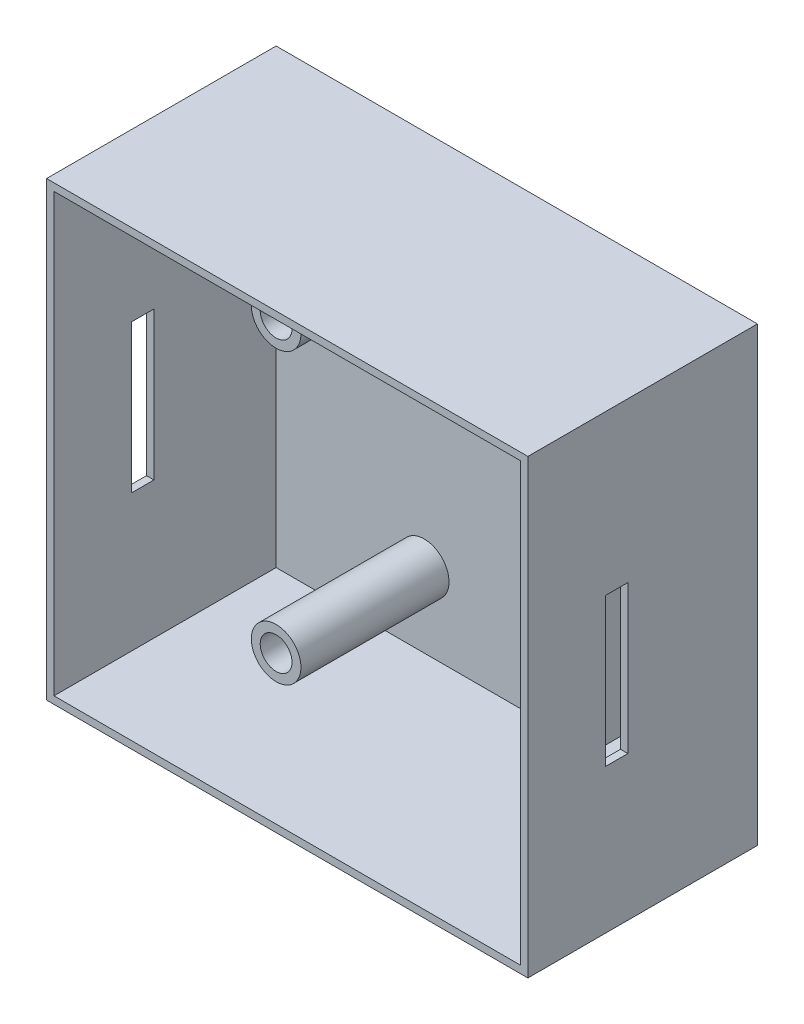
ISO-10303-21;
HEADER;
FILE_DESCRIPTION(('STEP AP214'),'2;1');
FILE_NAME('part.step','',(''),(''),'','','');
FILE_SCHEMA(('AUTOMOTIVE_DESIGN { 1 0 10303 214 1 1 1 1 }'));
ENDSEC;
DATA;
#1=APPLICATION_CONTEXT('core data for automotive mechanical design processes');
#2=APPLICATION_PROTOCOL_DEFINITION('international standard','automotive_design',2000,#1);
#3=PRODUCT_CONTEXT('',#1,'mechanical');
#4=PRODUCT('Part','Part','',(#3));
#5=PRODUCT_RELATED_PRODUCT_CATEGORY('part','',(#4));
#6=PRODUCT_DEFINITION_FORMATION('','',#4);
#7=PRODUCT_DEFINITION_CONTEXT('part definition',#1,'design');
#8=PRODUCT_DEFINITION('design','',#6,#7);
#9=PRODUCT_DEFINITION_SHAPE('','',#8);
#10=(LENGTH_UNIT() NAMED_UNIT(*) SI_UNIT(.MILLI.,.METRE.));
#11=(NAMED_UNIT(*) PLANE_ANGLE_UNIT() SI_UNIT($,.RADIAN.));
#12=(NAMED_UNIT(*) SI_UNIT($,.STERADIAN.) SOLID_ANGLE_UNIT());
#13=UNCERTAINTY_MEASURE_WITH_UNIT(LENGTH_MEASURE(1.E-05),#10,'distance_accuracy_value','');
#14=(GEOMETRIC_REPRESENTATION_CONTEXT(3) GLOBAL_UNCERTAINTY_ASSIGNED_CONTEXT((#13)) GLOBAL_UNIT_ASSIGNED_CONTEXT((#10,
#11,#12)) REPRESENTATION_CONTEXT('',''));
#15=CARTESIAN_POINT('',(0.,0.,0.));
#16=DIRECTION('',(0.,0.,1.));
#17=DIRECTION('',(1.,0.,0.));
#18=AXIS2_PLACEMENT_3D('',#15,#16,#17);
#19=CARTESIAN_POINT('',(0.,0.,0.));
#20=DIRECTION('',(0.,0.,-1.));
#21=DIRECTION('',(-1.,0.,0.));
#22=AXIS2_PLACEMENT_3D('',#19,#20,#21);
#23=PLANE('',#22);
#24=DIRECTION('',(0.,1.,0.));
#25=VECTOR('',#24,1.);
#26=CARTESIAN_POINT('',(-31.5,0.,0.));
#27=LINE('',#26,#25);
#28=CARTESIAN_POINT('',(-31.5,-29.5,0.));
#29=VERTEX_POINT('',#28);
#30=CARTESIAN_POINT('',(-31.5,29.5,0.));
#31=VERTEX_POINT('',#30);
#32=EDGE_CURVE('E359',#29,#31,#27,.T.);
#33=ORIENTED_EDGE('',*,*,#32,.F.);
#34=DIRECTION('',(1.,0.,0.));
#35=VECTOR('',#34,1.);
#36=CARTESIAN_POINT('',(0.,-29.5,0.));
#37=LINE('',#36,#35);
#38=CARTESIAN_POINT('',(31.5,-29.5,0.));
#39=VERTEX_POINT('',#38);
#40=EDGE_CURVE('E356',#29,#39,#37,.T.);
#41=ORIENTED_EDGE('',*,*,#40,.T.);
#42=DIRECTION('',(0.,1.,0.));
#43=VECTOR('',#42,1.);
#44=CARTESIAN_POINT('',(31.5,0.,0.));
#45=LINE('',#44,#43);
#46=CARTESIAN_POINT('',(31.5,-23.5,0.));
#47=VERTEX_POINT('',#46);
#48=EDGE_CURVE('E354',#39,#47,#45,.T.);
#49=ORIENTED_EDGE('',*,*,#48,.T.);
#50=DIRECTION('',(1.,0.,0.));
#51=VECTOR('',#50,1.);
#52=CARTESIAN_POINT('',(0.,-23.5,0.));
#53=LINE('',#52,#51);
#54=CARTESIAN_POINT('',(17.5,-23.5,0.));
#55=VERTEX_POINT('',#54);
#56=EDGE_CURVE('E301',#55,#47,#53,.T.);
#57=ORIENTED_EDGE('',*,*,#56,.F.);
#58=DIRECTION('',(0.,-1.,0.));
#59=VECTOR('',#58,1.);
#60=CARTESIAN_POINT('',(17.5,0.,0.));
#61=LINE('',#60,#59);
#62=CARTESIAN_POINT('',(17.5,24.5,0.));
#63=VERTEX_POINT('',#62);
#64=EDGE_CURVE('E298',#63,#55,#61,.T.);
#65=ORIENTED_EDGE('',*,*,#64,.F.);
#66=DIRECTION('',(-1.,0.,0.));
#67=VECTOR('',#66,1.);
#68=CARTESIAN_POINT('',(0.,24.5,0.));
#69=LINE('',#68,#67);
#70=CARTESIAN_POINT('',(31.5,24.5,0.));
#71=VERTEX_POINT('',#70);
#72=EDGE_CURVE('E295',#71,#63,#69,.T.);
#73=ORIENTED_EDGE('',*,*,#72,.F.);
#74=CARTESIAN_POINT('',(31.5,29.5,0.));
#75=VERTEX_POINT('',#74);
#76=EDGE_CURVE('E329',#71,#75,#45,.T.);
#77=ORIENTED_EDGE('',*,*,#76,.T.);
#78=DIRECTION('',(1.,0.,0.));
#79=VECTOR('',#78,1.);
#80=CARTESIAN_POINT('',(0.,29.5,0.));
#81=LINE('',#80,#79);
#82=EDGE_CURVE('E334',#31,#75,#81,.T.);
#83=ORIENTED_EDGE('',*,*,#82,.F.);
#84=EDGE_LOOP('',(#33,#41,#49,#57,#65,#73,#77,#83));
#85=FACE_BOUND('',#84,.T.);
#86=CARTESIAN_POINT('',(-11.5,19.5,0.));
#87=DIRECTION('',(0.,0.,1.));
#88=DIRECTION('',(1.,0.,0.));
#89=AXIS2_PLACEMENT_3D('',#86,#87,#88);
#90=CIRCLE('',#89,3.35);
#91=CARTESIAN_POINT('',(-8.14999999999998,19.5,0.));
#92=VERTEX_POINT('',#91);
#93=EDGE_CURVE('E398',#92,#92,#90,.F.);
#94=ORIENTED_EDGE('',*,*,#93,.T.);
#95=EDGE_LOOP('',(#94));
#96=FACE_BOUND('',#95,.T.);
#97=CARTESIAN_POINT('',(-11.5,-19.5,0.));
#98=DIRECTION('',(0.,0.,-1.));
#99=DIRECTION('',(-1.,0.,0.));
#100=AXIS2_PLACEMENT_3D('',#97,#98,#99);
#101=CIRCLE('',#100,3.35);
#102=CARTESIAN_POINT('',(-14.85,-19.5,0.));
#103=VERTEX_POINT('',#102);
#104=EDGE_CURVE('E11',#103,#103,#101,.F.);
#105=ORIENTED_EDGE('',*,*,#104,.F.);
#106=EDGE_LOOP('',(#105));
#107=FACE_BOUND('',#106,.T.);
#108=ADVANCED_FACE('F41',(#85,#96,#107),#23,.F.);
#109=CARTESIAN_POINT('',(-11.5,19.5,20.));
#110=DIRECTION('',(0.,0.,-1.));
#111=DIRECTION('',(-1.,0.,0.));
#112=AXIS2_PLACEMENT_3D('',#109,#110,#111);
#113=CYLINDRICAL_SURFACE('',#112,3.35);
#114=CARTESIAN_POINT('',(-11.5,19.5,20.));
#115=DIRECTION('',(0.,0.,1.));
#116=DIRECTION('',(1.,0.,0.));
#117=AXIS2_PLACEMENT_3D('',#114,#115,#116);
#118=CIRCLE('',#117,3.35);
#119=CARTESIAN_POINT('',(-8.14999999999998,19.5,20.));
#120=VERTEX_POINT('',#119);
#121=EDGE_CURVE('E399',#120,#120,#118,.F.);
#122=ORIENTED_EDGE('',*,*,#121,.T.);
#123=EDGE_LOOP('',(#122));
#124=FACE_BOUND('',#123,.T.);
#125=ORIENTED_EDGE('',*,*,#93,.F.);
#126=EDGE_LOOP('',(#125));
#127=FACE_BOUND('',#126,.T.);
#128=ADVANCED_FACE('F43',(#124,#127),#113,.T.);
#129=CARTESIAN_POINT('',(-11.5,19.5,20.));
#130=DIRECTION('',(0.,0.,-1.));
#131=DIRECTION('',(-1.,0.,0.));
#132=AXIS2_PLACEMENT_3D('',#129,#130,#131);
#133=CYLINDRICAL_SURFACE('',#132,2.15);
#134=CARTESIAN_POINT('',(-11.5,19.5,20.));
#135=DIRECTION('',(0.,0.,1.));
#136=DIRECTION('',(1.,0.,0.));
#137=AXIS2_PLACEMENT_3D('',#134,#135,#136);
#138=CIRCLE('',#137,2.15);
#139=CARTESIAN_POINT('',(-9.34999999999998,19.5,20.));
#140=VERTEX_POINT('',#139);
#141=EDGE_CURVE('E50',#140,#140,#138,.F.);
#142=ORIENTED_EDGE('',*,*,#141,.F.);
#143=EDGE_LOOP('',(#142));
#144=FACE_BOUND('',#143,.T.);
#145=CARTESIAN_POINT('',(-11.5,19.5,-1.));
#146=DIRECTION('',(0.,0.,-1.));
#147=DIRECTION('',(-1.,0.,0.));
#148=AXIS2_PLACEMENT_3D('',#145,#146,#147);
#149=CIRCLE('',#148,2.15);
#150=CARTESIAN_POINT('',(-13.65,19.5,-1.));
#151=VERTEX_POINT('',#150);
#152=EDGE_CURVE('E405',#151,#151,#149,.T.);
#153=ORIENTED_EDGE('',*,*,#152,.T.);
#154=EDGE_LOOP('',(#153));
#155=FACE_BOUND('',#154,.T.);
#156=ADVANCED_FACE('F497',(#144,#155),#133,.F.);
#157=CARTESIAN_POINT('',(0.,0.,20.));
#158=DIRECTION('',(0.,0.,1.));
#159=DIRECTION('',(1.,0.,0.));
#160=AXIS2_PLACEMENT_3D('',#157,#158,#159);
#161=PLANE('',#160);
#162=ORIENTED_EDGE('',*,*,#121,.F.);
#163=EDGE_LOOP('',(#162));
#164=FACE_BOUND('',#163,.T.);
#165=ORIENTED_EDGE('',*,*,#141,.T.);
#166=EDGE_LOOP('',(#165));
#167=FACE_BOUND('',#166,.T.);
#168=ADVANCED_FACE('F502',(#164,#167),#161,.T.);
#169=CARTESIAN_POINT('',(-11.5,-19.5,20.));
#170=DIRECTION('',(0.,0.,-1.));
#171=DIRECTION('',(-1.,0.,0.));
#172=AXIS2_PLACEMENT_3D('',#169,#170,#171);
#173=CYLINDRICAL_SURFACE('',#172,2.15);
#174=CARTESIAN_POINT('',(-11.5,-19.5,20.));
#175=DIRECTION('',(0.,0.,1.));
#176=DIRECTION('',(1.,0.,0.));
#177=AXIS2_PLACEMENT_3D('',#174,#175,#176);
#178=CIRCLE('',#177,2.15);
#179=CARTESIAN_POINT('',(-9.34999999999998,-19.5,20.));
#180=VERTEX_POINT('',#179);
#181=EDGE_CURVE('E375',#180,#180,#178,.T.);
#182=ORIENTED_EDGE('',*,*,#181,.T.);
#183=EDGE_LOOP('',(#182));
#184=FACE_BOUND('',#183,.T.);
#185=CARTESIAN_POINT('',(-11.5,-19.5,-1.));
#186=DIRECTION('',(0.,0.,-1.));
#187=DIRECTION('',(-1.,0.,0.));
#188=AXIS2_PLACEMENT_3D('',#185,#186,#187);
#189=CIRCLE('',#188,2.15);
#190=CARTESIAN_POINT('',(-13.65,-19.5,-1.));
#191=VERTEX_POINT('',#190);
#192=EDGE_CURVE('E45',#191,#191,#189,.T.);
#193=ORIENTED_EDGE('',*,*,#192,.T.);
#194=EDGE_LOOP('',(#193));
#195=FACE_BOUND('',#194,.T.);
#196=ADVANCED_FACE('F511',(#184,#195),#173,.F.);
#197=CARTESIAN_POINT('',(-11.5,-19.5,20.));
#198=DIRECTION('',(0.,0.,-1.));
#199=DIRECTION('',(-1.,0.,0.));
#200=AXIS2_PLACEMENT_3D('',#197,#198,#199);
#201=CYLINDRICAL_SURFACE('',#200,3.35);
#202=CARTESIAN_POINT('',(-11.5,-19.5,20.));
#203=DIRECTION('',(0.,0.,1.));
#204=DIRECTION('',(1.,0.,0.));
#205=AXIS2_PLACEMENT_3D('',#202,#203,#204);
#206=CIRCLE('',#205,3.35);
#207=CARTESIAN_POINT('',(-8.14999999999998,-19.5,20.));
#208=VERTEX_POINT('',#207);
#209=EDGE_CURVE('E378',#208,#208,#206,.T.);
#210=ORIENTED_EDGE('',*,*,#209,.F.);
#211=EDGE_LOOP('',(#210));
#212=FACE_BOUND('',#211,.T.);
#213=ORIENTED_EDGE('',*,*,#104,.T.);
#214=EDGE_LOOP('',(#213));
#215=FACE_BOUND('',#214,.T.);
#216=ADVANCED_FACE('F510',(#212,#215),#201,.T.);
#217=CARTESIAN_POINT('',(0.,0.,20.));
#218=DIRECTION('',(0.,0.,1.));
#219=DIRECTION('',(1.,0.,0.));
#220=AXIS2_PLACEMENT_3D('',#217,#218,#219);
#221=PLANE('',#220);
#222=ORIENTED_EDGE('',*,*,#181,.F.);
#223=EDGE_LOOP('',(#222));
#224=FACE_BOUND('',#223,.T.);
#225=ORIENTED_EDGE('',*,*,#209,.T.);
#226=EDGE_LOOP('',(#225));
#227=FACE_BOUND('',#226,.T.);
#228=ADVANCED_FACE('F424',(#224,#227),#221,.T.);
#229=CARTESIAN_POINT('',(31.5,0.,30.));
#230=DIRECTION('',(-1.,0.,0.));
#231=DIRECTION('',(0.,0.,1.));
#232=AXIS2_PLACEMENT_3D('',#229,#230,#231);
#233=PLANE('',#232);
#234=DIRECTION('',(0.,1.,0.));
#235=VECTOR('',#234,1.);
#236=CARTESIAN_POINT('',(31.5,0.,19.5));
#237=LINE('',#236,#235);
#238=CARTESIAN_POINT('',(31.5,-11.,19.5));
#239=VERTEX_POINT('',#238);
#240=CARTESIAN_POINT('',(31.5,9.,19.5));
#241=VERTEX_POINT('',#240);
#242=EDGE_CURVE('E270',#239,#241,#237,.T.);
#243=ORIENTED_EDGE('',*,*,#242,.F.);
#244=DIRECTION('',(0.,0.,1.));
#245=VECTOR('',#244,1.);
#246=CARTESIAN_POINT('',(31.5,-11.,30.));
#247=LINE('',#246,#245);
#248=CARTESIAN_POINT('',(31.5,-11.,16.5));
#249=VERTEX_POINT('',#248);
#250=EDGE_CURVE('E256',#249,#239,#247,.T.);
#251=ORIENTED_EDGE('',*,*,#250,.F.);
#252=DIRECTION('',(0.,-1.,0.));
#253=VECTOR('',#252,1.);
#254=CARTESIAN_POINT('',(31.5,0.,16.5));
#255=LINE('',#254,#253);
#256=CARTESIAN_POINT('',(31.5,9.,16.5));
#257=VERTEX_POINT('',#256);
#258=EDGE_CURVE('E209',#257,#249,#255,.T.);
#259=ORIENTED_EDGE('',*,*,#258,.F.);
#260=DIRECTION('',(0.,0.,-1.));
#261=VECTOR('',#260,1.);
#262=CARTESIAN_POINT('',(31.5,9.,30.));
#263=LINE('',#262,#261);
#264=EDGE_CURVE('E265',#241,#257,#263,.T.);
#265=ORIENTED_EDGE('',*,*,#264,.F.);
#266=EDGE_LOOP('',(#243,#251,#259,#265));
#267=FACE_BOUND('',#266,.T.);
#268=DIRECTION('',(0.,1.,0.));
#269=VECTOR('',#268,1.);
#270=CARTESIAN_POINT('',(31.5,0.,10.));
#271=LINE('',#270,#269);
#272=CARTESIAN_POINT('',(31.5,-23.5,10.));
#273=VERTEX_POINT('',#272);
#274=CARTESIAN_POINT('',(31.5,-22.5,10.));
#275=VERTEX_POINT('',#274);
#276=EDGE_CURVE('E283',#273,#275,#271,.T.);
#277=ORIENTED_EDGE('',*,*,#276,.F.);
#278=DIRECTION('',(0.,0.,-1.));
#279=VECTOR('',#278,1.);
#280=CARTESIAN_POINT('',(31.5,-23.5,10.));
#281=LINE('',#280,#279);
#282=EDGE_CURVE('E311',#273,#47,#281,.T.);
#283=ORIENTED_EDGE('',*,*,#282,.T.);
#284=ORIENTED_EDGE('',*,*,#48,.F.);
#285=DIRECTION('',(0.,0.,-1.));
#286=VECTOR('',#285,1.);
#287=CARTESIAN_POINT('',(31.5,-29.5,30.));
#288=LINE('',#287,#286);
#289=CARTESIAN_POINT('',(31.5,-29.5,30.));
#290=VERTEX_POINT('',#289);
#291=EDGE_CURVE('E372',#290,#39,#288,.T.);
#292=ORIENTED_EDGE('',*,*,#291,.F.);
#293=DIRECTION('',(0.,1.,0.));
#294=VECTOR('',#293,1.);
#295=CARTESIAN_POINT('',(31.5,0.,30.));
#296=LINE('',#295,#294);
#297=CARTESIAN_POINT('',(31.5,29.5,30.));
#298=VERTEX_POINT('',#297);
#299=EDGE_CURVE('E330',#290,#298,#296,.T.);
#300=ORIENTED_EDGE('',*,*,#299,.T.);
#301=DIRECTION('',(0.,0.,-1.));
#302=VECTOR('',#301,1.);
#303=CARTESIAN_POINT('',(31.5,29.5,30.));
#304=LINE('',#303,#302);
#305=EDGE_CURVE('E353',#298,#75,#304,.T.);
#306=ORIENTED_EDGE('',*,*,#305,.T.);
#307=ORIENTED_EDGE('',*,*,#76,.F.);
#308=DIRECTION('',(0.,0.,-1.));
#309=VECTOR('',#308,1.);
#310=CARTESIAN_POINT('',(31.5,24.5,10.));
#311=LINE('',#310,#309);
#312=CARTESIAN_POINT('',(31.5,24.5,10.));
#313=VERTEX_POINT('',#312);
#314=EDGE_CURVE('E320',#313,#71,#311,.T.);
#315=ORIENTED_EDGE('',*,*,#314,.F.);
#316=CARTESIAN_POINT('',(31.5,23.5,10.));
#317=VERTEX_POINT('',#316);
#318=EDGE_CURVE('E280',#317,#313,#271,.T.);
#319=ORIENTED_EDGE('',*,*,#318,.F.);
#320=DIRECTION('',(0.,0.,-1.));
#321=VECTOR('',#320,1.);
#322=CARTESIAN_POINT('',(31.5,23.5,10.));
#323=LINE('',#322,#321);
#324=CARTESIAN_POINT('',(31.5,23.5,0.));
#325=VERTEX_POINT('',#324);
#326=EDGE_CURVE('E323',#317,#325,#323,.T.);
#327=ORIENTED_EDGE('',*,*,#326,.T.);
#328=CARTESIAN_POINT('',(31.5,-22.5,0.));
#329=VERTEX_POINT('',#328);
#330=EDGE_CURVE('E357',#329,#325,#45,.T.);
#331=ORIENTED_EDGE('',*,*,#330,.F.);
#332=DIRECTION('',(0.,0.,-1.));
#333=VECTOR('',#332,1.);
#334=CARTESIAN_POINT('',(31.5,-22.5,10.));
#335=LINE('',#334,#333);
#336=EDGE_CURVE('E308',#275,#329,#335,.T.);
#337=ORIENTED_EDGE('',*,*,#336,.F.);
#338=EDGE_LOOP('',(#277,#283,#284,#292,#300,#306,#307,#315,#319,#327,#331,#337));
#339=FACE_BOUND('',#338,.T.);
#340=ADVANCED_FACE('F420',(#267,#339),#233,.T.);
#341=CARTESIAN_POINT('',(0.,-29.5,30.));
#342=DIRECTION('',(0.,1.,0.));
#343=DIRECTION('',(0.,0.,1.));
#344=AXIS2_PLACEMENT_3D('',#341,#342,#343);
#345=PLANE('',#344);
#346=ORIENTED_EDGE('',*,*,#40,.F.);
#347=DIRECTION('',(0.,0.,-1.));
#348=VECTOR('',#347,1.);
#349=CARTESIAN_POINT('',(-31.5,-29.5,30.));
#350=LINE('',#349,#348);
#351=CARTESIAN_POINT('',(-31.5,-29.5,30.));
#352=VERTEX_POINT('',#351);
#353=EDGE_CURVE('E369',#352,#29,#350,.T.);
#354=ORIENTED_EDGE('',*,*,#353,.F.);
#355=DIRECTION('',(1.,0.,0.));
#356=VECTOR('',#355,1.);
#357=CARTESIAN_POINT('',(0.,-29.5,30.));
#358=LINE('',#357,#356);
#359=EDGE_CURVE('E333',#352,#290,#358,.T.);
#360=ORIENTED_EDGE('',*,*,#359,.T.);
#361=ORIENTED_EDGE('',*,*,#291,.T.);
#362=EDGE_LOOP('',(#346,#354,#360,#361));
#363=FACE_BOUND('',#362,.T.);
#364=ADVANCED_FACE('F423',(#363),#345,.T.);
#365=CARTESIAN_POINT('',(-31.5,0.,30.));
#366=DIRECTION('',(-1.,0.,0.));
#367=DIRECTION('',(0.,0.,1.));
#368=AXIS2_PLACEMENT_3D('',#365,#366,#367);
#369=PLANE('',#368);
#370=DIRECTION('',(0.,0.,1.));
#371=VECTOR('',#370,1.);
#372=CARTESIAN_POINT('',(-31.5,-11.,30.));
#373=LINE('',#372,#371);
#374=CARTESIAN_POINT('',(-31.5,-11.,16.5));
#375=VERTEX_POINT('',#374);
#376=CARTESIAN_POINT('',(-31.5,-11.,19.5));
#377=VERTEX_POINT('',#376);
#378=EDGE_CURVE('E246',#375,#377,#373,.T.);
#379=ORIENTED_EDGE('',*,*,#378,.T.);
#380=DIRECTION('',(0.,1.,0.));
#381=VECTOR('',#380,1.);
#382=CARTESIAN_POINT('',(-31.5,0.,19.5));
#383=LINE('',#382,#381);
#384=CARTESIAN_POINT('',(-31.5,9.,19.5));
#385=VERTEX_POINT('',#384);
#386=EDGE_CURVE('E267',#377,#385,#383,.T.);
#387=ORIENTED_EDGE('',*,*,#386,.T.);
#388=DIRECTION('',(0.,0.,-1.));
#389=VECTOR('',#388,1.);
#390=CARTESIAN_POINT('',(-31.5,9.,30.));
#391=LINE('',#390,#389);
#392=CARTESIAN_POINT('',(-31.5,9.,16.5));
#393=VERTEX_POINT('',#392);
#394=EDGE_CURVE('E262',#385,#393,#391,.T.);
#395=ORIENTED_EDGE('',*,*,#394,.T.);
#396=DIRECTION('',(0.,-1.,0.));
#397=VECTOR('',#396,1.);
#398=CARTESIAN_POINT('',(-31.5,0.,16.5));
#399=LINE('',#398,#397);
#400=EDGE_CURVE('E258',#393,#375,#399,.T.);
#401=ORIENTED_EDGE('',*,*,#400,.T.);
#402=EDGE_LOOP('',(#379,#387,#395,#401));
#403=FACE_BOUND('',#402,.T.);
#404=ORIENTED_EDGE('',*,*,#32,.T.);
#405=DIRECTION('',(0.,0.,-1.));
#406=VECTOR('',#405,1.);
#407=CARTESIAN_POINT('',(-31.5,29.5,30.));
#408=LINE('',#407,#406);
#409=CARTESIAN_POINT('',(-31.5,29.5,30.));
#410=VERTEX_POINT('',#409);
#411=EDGE_CURVE('E366',#410,#31,#408,.T.);
#412=ORIENTED_EDGE('',*,*,#411,.F.);
#413=DIRECTION('',(0.,1.,0.));
#414=VECTOR('',#413,1.);
#415=CARTESIAN_POINT('',(-31.5,0.,30.));
#416=LINE('',#415,#414);
#417=EDGE_CURVE('E337',#352,#410,#416,.T.);
#418=ORIENTED_EDGE('',*,*,#417,.F.);
#419=ORIENTED_EDGE('',*,*,#353,.T.);
#420=EDGE_LOOP('',(#404,#412,#418,#419));
#421=FACE_BOUND('',#420,.T.);
#422=ADVANCED_FACE('F473',(#403,#421),#369,.F.);
#423=CARTESIAN_POINT('',(0.,29.5,30.));
#424=DIRECTION('',(0.,1.,0.));
#425=DIRECTION('',(0.,0.,1.));
#426=AXIS2_PLACEMENT_3D('',#423,#424,#425);
#427=PLANE('',#426);
#428=ORIENTED_EDGE('',*,*,#82,.T.);
#429=ORIENTED_EDGE('',*,*,#305,.F.);
#430=DIRECTION('',(1.,0.,0.));
#431=VECTOR('',#430,1.);
#432=CARTESIAN_POINT('',(0.,29.5,30.));
#433=LINE('',#432,#431);
#434=EDGE_CURVE('E339',#410,#298,#433,.T.);
#435=ORIENTED_EDGE('',*,*,#434,.F.);
#436=ORIENTED_EDGE('',*,*,#411,.T.);
#437=EDGE_LOOP('',(#428,#429,#435,#436));
#438=FACE_BOUND('',#437,.T.);
#439=ADVANCED_FACE('F475',(#438),#427,.F.);
#440=CARTESIAN_POINT('',(0.,0.,30.));
#441=DIRECTION('',(0.,0.,1.));
#442=DIRECTION('',(1.,0.,0.));
#443=AXIS2_PLACEMENT_3D('',#440,#441,#442);
#444=PLANE('',#443);
#445=ORIENTED_EDGE('',*,*,#299,.F.);
#446=ORIENTED_EDGE('',*,*,#359,.F.);
#447=ORIENTED_EDGE('',*,*,#417,.T.);
#448=ORIENTED_EDGE('',*,*,#434,.T.);
#449=EDGE_LOOP('',(#445,#446,#447,#448));
#450=FACE_BOUND('',#449,.T.);
#451=DIRECTION('',(0.,1.,0.));
#452=VECTOR('',#451,1.);
#453=CARTESIAN_POINT('',(-32.5,0.,30.));
#454=LINE('',#453,#452);
#455=CARTESIAN_POINT('',(-32.5,-30.5,30.));
#456=VERTEX_POINT('',#455);
#457=CARTESIAN_POINT('',(-32.5,30.5,30.));
#458=VERTEX_POINT('',#457);
#459=EDGE_CURVE('E341',#456,#458,#454,.T.);
#460=ORIENTED_EDGE('',*,*,#459,.F.);
#461=DIRECTION('',(-1.,0.,0.));
#462=VECTOR('',#461,1.);
#463=CARTESIAN_POINT('',(0.,-30.5,30.));
#464=LINE('',#463,#462);
#465=CARTESIAN_POINT('',(32.5,-30.5,30.));
#466=VERTEX_POINT('',#465);
#467=EDGE_CURVE('E344',#466,#456,#464,.T.);
#468=ORIENTED_EDGE('',*,*,#467,.F.);
#469=DIRECTION('',(0.,1.,0.));
#470=VECTOR('',#469,1.);
#471=CARTESIAN_POINT('',(32.5,0.,30.));
#472=LINE('',#471,#470);
#473=CARTESIAN_POINT('',(32.5,30.5,30.));
#474=VERTEX_POINT('',#473);
#475=EDGE_CURVE('E347',#466,#474,#472,.T.);
#476=ORIENTED_EDGE('',*,*,#475,.T.);
#477=DIRECTION('',(-1.,0.,0.));
#478=VECTOR('',#477,1.);
#479=CARTESIAN_POINT('',(0.,30.5,30.));
#480=LINE('',#479,#478);
#481=EDGE_CURVE('E350',#474,#458,#480,.T.);
#482=ORIENTED_EDGE('',*,*,#481,.T.);
#483=EDGE_LOOP('',(#460,#468,#476,#482));
#484=FACE_BOUND('',#483,.T.);
#485=ADVANCED_FACE('F466',(#450,#484),#444,.T.);
#486=CARTESIAN_POINT('',(18.5,0.,10.));
#487=DIRECTION('',(1.,0.,0.));
#488=DIRECTION('',(0.,0.,-1.));
#489=AXIS2_PLACEMENT_3D('',#486,#487,#488);
#490=PLANE('',#489);
#491=DIRECTION('',(0.,-1.,0.));
#492=VECTOR('',#491,1.);
#493=CARTESIAN_POINT('',(18.5,0.,0.));
#494=LINE('',#493,#492);
#495=CARTESIAN_POINT('',(18.5,23.5,0.));
#496=VERTEX_POINT('',#495);
#497=CARTESIAN_POINT('',(18.5,-22.5,0.));
#498=VERTEX_POINT('',#497);
#499=EDGE_CURVE('E272',#496,#498,#494,.T.);
#500=ORIENTED_EDGE('',*,*,#499,.F.);
#501=DIRECTION('',(0.,0.,-1.));
#502=VECTOR('',#501,1.);
#503=CARTESIAN_POINT('',(18.5,23.5,10.));
#504=LINE('',#503,#502);
#505=CARTESIAN_POINT('',(18.5,23.5,10.));
#506=VERTEX_POINT('',#505);
#507=EDGE_CURVE('E326',#506,#496,#504,.T.);
#508=ORIENTED_EDGE('',*,*,#507,.F.);
#509=DIRECTION('',(0.,-1.,0.));
#510=VECTOR('',#509,1.);
#511=CARTESIAN_POINT('',(18.5,0.,10.));
#512=LINE('',#511,#510);
#513=CARTESIAN_POINT('',(18.5,-22.5,10.));
#514=VERTEX_POINT('',#513);
#515=EDGE_CURVE('E273',#506,#514,#512,.T.);
#516=ORIENTED_EDGE('',*,*,#515,.T.);
#517=DIRECTION('',(0.,0.,-1.));
#518=VECTOR('',#517,1.);
#519=CARTESIAN_POINT('',(18.5,-22.5,10.));
#520=LINE('',#519,#518);
#521=EDGE_CURVE('E291',#514,#498,#520,.T.);
#522=ORIENTED_EDGE('',*,*,#521,.T.);
#523=EDGE_LOOP('',(#500,#508,#516,#522));
#524=FACE_BOUND('',#523,.T.);
#525=ADVANCED_FACE('F441',(#524),#490,.T.);
#526=CARTESIAN_POINT('',(0.,23.5,10.));
#527=DIRECTION('',(0.,-1.,0.));
#528=DIRECTION('',(1.,0.,0.));
#529=AXIS2_PLACEMENT_3D('',#526,#527,#528);
#530=PLANE('',#529);
#531=DIRECTION('',(-1.,0.,0.));
#532=VECTOR('',#531,1.);
#533=CARTESIAN_POINT('',(0.,23.5,0.));
#534=LINE('',#533,#532);
#535=EDGE_CURVE('E293',#325,#496,#534,.T.);
#536=ORIENTED_EDGE('',*,*,#535,.F.);
#537=ORIENTED_EDGE('',*,*,#326,.F.);
#538=DIRECTION('',(-1.,0.,0.));
#539=VECTOR('',#538,1.);
#540=CARTESIAN_POINT('',(0.,23.5,10.));
#541=LINE('',#540,#539);
#542=EDGE_CURVE('E276',#317,#506,#541,.T.);
#543=ORIENTED_EDGE('',*,*,#542,.T.);
#544=ORIENTED_EDGE('',*,*,#507,.T.);
#545=EDGE_LOOP('',(#536,#537,#543,#544));
#546=FACE_BOUND('',#545,.T.);
#547=ADVANCED_FACE('F446',(#546),#530,.T.);
#548=CARTESIAN_POINT('',(0.,24.5,10.));
#549=DIRECTION('',(0.,-1.,0.));
#550=DIRECTION('',(1.,0.,0.));
#551=AXIS2_PLACEMENT_3D('',#548,#549,#550);
#552=PLANE('',#551);
#553=ORIENTED_EDGE('',*,*,#72,.T.);
#554=DIRECTION('',(0.,0.,-1.));
#555=VECTOR('',#554,1.);
#556=CARTESIAN_POINT('',(17.5,24.5,10.));
#557=LINE('',#556,#555);
#558=CARTESIAN_POINT('',(17.5,24.5,10.));
#559=VERTEX_POINT('',#558);
#560=EDGE_CURVE('E317',#559,#63,#557,.T.);
#561=ORIENTED_EDGE('',*,*,#560,.F.);
#562=DIRECTION('',(-1.,0.,0.));
#563=VECTOR('',#562,1.);
#564=CARTESIAN_POINT('',(0.,24.5,10.));
#565=LINE('',#564,#563);
#566=EDGE_CURVE('E282',#313,#559,#565,.T.);
#567=ORIENTED_EDGE('',*,*,#566,.F.);
#568=ORIENTED_EDGE('',*,*,#314,.T.);
#569=EDGE_LOOP('',(#553,#561,#567,#568));
#570=FACE_BOUND('',#569,.T.);
#571=ADVANCED_FACE('F452',(#570),#552,.F.);
#572=CARTESIAN_POINT('',(17.5,0.,10.));
#573=DIRECTION('',(1.,0.,0.));
#574=DIRECTION('',(0.,1.,0.));
#575=AXIS2_PLACEMENT_3D('',#572,#573,#574);
#576=PLANE('',#575);
#577=ORIENTED_EDGE('',*,*,#64,.T.);
#578=DIRECTION('',(0.,0.,-1.));
#579=VECTOR('',#578,1.);
#580=CARTESIAN_POINT('',(17.5,-23.5,10.));
#581=LINE('',#580,#579);
#582=CARTESIAN_POINT('',(17.5,-23.5,10.));
#583=VERTEX_POINT('',#582);
#584=EDGE_CURVE('E314',#583,#55,#581,.T.);
#585=ORIENTED_EDGE('',*,*,#584,.F.);
#586=DIRECTION('',(0.,-1.,0.));
#587=VECTOR('',#586,1.);
#588=CARTESIAN_POINT('',(17.5,0.,10.));
#589=LINE('',#588,#587);
#590=EDGE_CURVE('E285',#559,#583,#589,.T.);
#591=ORIENTED_EDGE('',*,*,#590,.F.);
#592=ORIENTED_EDGE('',*,*,#560,.T.);
#593=EDGE_LOOP('',(#577,#585,#591,#592));
#594=FACE_BOUND('',#593,.T.);
#595=ADVANCED_FACE('F456',(#594),#576,.F.);
#596=CARTESIAN_POINT('',(0.,-23.5,10.));
#597=DIRECTION('',(0.,1.,0.));
#598=DIRECTION('',(0.,0.,1.));
#599=AXIS2_PLACEMENT_3D('',#596,#597,#598);
#600=PLANE('',#599);
#601=ORIENTED_EDGE('',*,*,#56,.T.);
#602=ORIENTED_EDGE('',*,*,#282,.F.);
#603=DIRECTION('',(1.,0.,0.));
#604=VECTOR('',#603,1.);
#605=CARTESIAN_POINT('',(0.,-23.5,10.));
#606=LINE('',#605,#604);
#607=EDGE_CURVE('E287',#583,#273,#606,.T.);
#608=ORIENTED_EDGE('',*,*,#607,.F.);
#609=ORIENTED_EDGE('',*,*,#584,.T.);
#610=EDGE_LOOP('',(#601,#602,#608,#609));
#611=FACE_BOUND('',#610,.T.);
#612=ADVANCED_FACE('F458',(#611),#600,.F.);
#613=CARTESIAN_POINT('',(0.,-22.5,10.));
#614=DIRECTION('',(0.,-1.,0.));
#615=DIRECTION('',(0.,0.,-1.));
#616=AXIS2_PLACEMENT_3D('',#613,#614,#615);
#617=PLANE('',#616);
#618=DIRECTION('',(-1.,0.,0.));
#619=VECTOR('',#618,1.);
#620=CARTESIAN_POINT('',(0.,-22.5,0.));
#621=LINE('',#620,#619);
#622=EDGE_CURVE('E277',#329,#498,#621,.T.);
#623=ORIENTED_EDGE('',*,*,#622,.T.);
#624=ORIENTED_EDGE('',*,*,#521,.F.);
#625=DIRECTION('',(-1.,0.,0.));
#626=VECTOR('',#625,1.);
#627=CARTESIAN_POINT('',(0.,-22.5,10.));
#628=LINE('',#627,#626);
#629=EDGE_CURVE('E289',#275,#514,#628,.T.);
#630=ORIENTED_EDGE('',*,*,#629,.F.);
#631=ORIENTED_EDGE('',*,*,#336,.T.);
#632=EDGE_LOOP('',(#623,#624,#630,#631));
#633=FACE_BOUND('',#632,.T.);
#634=ADVANCED_FACE('F438',(#633),#617,.F.);
#635=CARTESIAN_POINT('',(0.,0.,10.));
#636=DIRECTION('',(0.,0.,1.));
#637=DIRECTION('',(1.,0.,0.));
#638=AXIS2_PLACEMENT_3D('',#635,#636,#637);
#639=PLANE('',#638);
#640=ORIENTED_EDGE('',*,*,#515,.F.);
#641=ORIENTED_EDGE('',*,*,#542,.F.);
#642=ORIENTED_EDGE('',*,*,#318,.T.);
#643=ORIENTED_EDGE('',*,*,#566,.T.);
#644=ORIENTED_EDGE('',*,*,#590,.T.);
#645=ORIENTED_EDGE('',*,*,#607,.T.);
#646=ORIENTED_EDGE('',*,*,#276,.T.);
#647=ORIENTED_EDGE('',*,*,#629,.T.);
#648=EDGE_LOOP('',(#640,#641,#642,#643,#644,#645,#646,#647));
#649=FACE_BOUND('',#648,.T.);
#650=ADVANCED_FACE('F434',(#649),#639,.T.);
#651=ORIENTED_EDGE('',*,*,#330,.T.);
#652=ORIENTED_EDGE('',*,*,#535,.T.);
#653=ORIENTED_EDGE('',*,*,#499,.T.);
#654=ORIENTED_EDGE('',*,*,#622,.F.);
#655=EDGE_LOOP('',(#651,#652,#653,#654));
#656=FACE_BOUND('',#655,.T.);
#657=ADVANCED_FACE('F477',(#656),#23,.F.);
#658=CARTESIAN_POINT('',(0.,0.,-1.));
#659=DIRECTION('',(0.,0.,-1.));
#660=DIRECTION('',(-1.,0.,0.));
#661=AXIS2_PLACEMENT_3D('',#658,#659,#660);
#662=PLANE('',#661);
#663=ORIENTED_EDGE('',*,*,#192,.F.);
#664=EDGE_LOOP('',(#663));
#665=FACE_BOUND('',#664,.T.);
#666=ORIENTED_EDGE('',*,*,#152,.F.);
#667=EDGE_LOOP('',(#666));
#668=FACE_BOUND('',#667,.T.);
#669=DIRECTION('',(0.,-1.,0.));
#670=VECTOR('',#669,1.);
#671=CARTESIAN_POINT('',(32.5,30.5,-1.));
#672=LINE('',#671,#670);
#673=CARTESIAN_POINT('',(32.5,30.5,-1.));
#674=VERTEX_POINT('',#673);
#675=CARTESIAN_POINT('',(32.5,-30.5,-1.));
#676=VERTEX_POINT('',#675);
#677=EDGE_CURVE('E381',#674,#676,#672,.T.);
#678=ORIENTED_EDGE('',*,*,#677,.T.);
#679=DIRECTION('',(-1.,0.,0.));
#680=VECTOR('',#679,1.);
#681=CARTESIAN_POINT('',(32.5,-30.5,-1.));
#682=LINE('',#681,#680);
#683=CARTESIAN_POINT('',(-32.5,-30.5,-1.));
#684=VERTEX_POINT('',#683);
#685=EDGE_CURVE('E384',#676,#684,#682,.T.);
#686=ORIENTED_EDGE('',*,*,#685,.T.);
#687=DIRECTION('',(0.,1.,0.));
#688=VECTOR('',#687,1.);
#689=CARTESIAN_POINT('',(-32.5,30.5,-1.));
#690=LINE('',#689,#688);
#691=CARTESIAN_POINT('',(-32.5,30.5,-1.));
#692=VERTEX_POINT('',#691);
#693=EDGE_CURVE('E386',#684,#692,#690,.T.);
#694=ORIENTED_EDGE('',*,*,#693,.T.);
#695=DIRECTION('',(1.,0.,0.));
#696=VECTOR('',#695,1.);
#697=CARTESIAN_POINT('',(32.5,30.5,-1.));
#698=LINE('',#697,#696);
#699=EDGE_CURVE('E388',#692,#674,#698,.T.);
#700=ORIENTED_EDGE('',*,*,#699,.T.);
#701=EDGE_LOOP('',(#678,#686,#694,#700));
#702=FACE_BOUND('',#701,.T.);
#703=ADVANCED_FACE('F479',(#665,#668,#702),#662,.T.);
#704=CARTESIAN_POINT('',(32.5,30.5,-1.));
#705=DIRECTION('',(0.,-1.,0.));
#706=DIRECTION('',(0.,0.,-1.));
#707=AXIS2_PLACEMENT_3D('',#704,#705,#706);
#708=PLANE('',#707);
#709=DIRECTION('',(0.,0.,1.));
#710=VECTOR('',#709,1.);
#711=CARTESIAN_POINT('',(-32.5,30.5,-1.));
#712=LINE('',#711,#710);
#713=EDGE_CURVE('E392',#692,#458,#712,.T.);
#714=ORIENTED_EDGE('',*,*,#713,.T.);
#715=ORIENTED_EDGE('',*,*,#481,.F.);
#716=DIRECTION('',(0.,0.,1.));
#717=VECTOR('',#716,1.);
#718=CARTESIAN_POINT('',(32.5,30.5,-1.));
#719=LINE('',#718,#717);
#720=EDGE_CURVE('E390',#674,#474,#719,.T.);
#721=ORIENTED_EDGE('',*,*,#720,.F.);
#722=ORIENTED_EDGE('',*,*,#699,.F.);
#723=EDGE_LOOP('',(#714,#715,#721,#722));
#724=FACE_BOUND('',#723,.T.);
#725=ADVANCED_FACE('F486',(#724),#708,.F.);
#726=CARTESIAN_POINT('',(32.5,30.5,-1.));
#727=DIRECTION('',(-1.,0.,0.));
#728=DIRECTION('',(0.,-1.,0.));
#729=AXIS2_PLACEMENT_3D('',#726,#727,#728);
#730=PLANE('',#729);
#731=DIRECTION('',(0.,0.,-1.));
#732=VECTOR('',#731,1.);
#733=CARTESIAN_POINT('',(32.5,-11.,19.5));
#734=LINE('',#733,#732);
#735=CARTESIAN_POINT('',(32.5,-11.,19.5));
#736=VERTEX_POINT('',#735);
#737=CARTESIAN_POINT('',(32.5,-11.,16.5));
#738=VERTEX_POINT('',#737);
#739=EDGE_CURVE('E215',#736,#738,#734,.T.);
#740=ORIENTED_EDGE('',*,*,#739,.F.);
#741=DIRECTION('',(0.,-1.,0.));
#742=VECTOR('',#741,1.);
#743=CARTESIAN_POINT('',(32.5,9.,19.5));
#744=LINE('',#743,#742);
#745=CARTESIAN_POINT('',(32.5,9.,19.5));
#746=VERTEX_POINT('',#745);
#747=EDGE_CURVE('E221',#746,#736,#744,.T.);
#748=ORIENTED_EDGE('',*,*,#747,.F.);
#749=DIRECTION('',(0.,0.,1.));
#750=VECTOR('',#749,1.);
#751=CARTESIAN_POINT('',(32.5,9.,19.5));
#752=LINE('',#751,#750);
#753=CARTESIAN_POINT('',(32.5,9.,16.5));
#754=VERTEX_POINT('',#753);
#755=EDGE_CURVE('E226',#754,#746,#752,.T.);
#756=ORIENTED_EDGE('',*,*,#755,.F.);
#757=DIRECTION('',(0.,1.,0.));
#758=VECTOR('',#757,1.);
#759=CARTESIAN_POINT('',(32.5,9.,16.5));
#760=LINE('',#759,#758);
#761=EDGE_CURVE('E206',#738,#754,#760,.T.);
#762=ORIENTED_EDGE('',*,*,#761,.F.);
#763=EDGE_LOOP('',(#740,#748,#756,#762));
#764=FACE_BOUND('',#763,.T.);
#765=ORIENTED_EDGE('',*,*,#720,.T.);
#766=ORIENTED_EDGE('',*,*,#475,.F.);
#767=DIRECTION('',(0.,0.,1.));
#768=VECTOR('',#767,1.);
#769=CARTESIAN_POINT('',(32.5,-30.5,-1.));
#770=LINE('',#769,#768);
#771=EDGE_CURVE('E396',#676,#466,#770,.T.);
#772=ORIENTED_EDGE('',*,*,#771,.F.);
#773=ORIENTED_EDGE('',*,*,#677,.F.);
#774=EDGE_LOOP('',(#765,#766,#772,#773));
#775=FACE_BOUND('',#774,.T.);
#776=ADVANCED_FACE('F223',(#764,#775),#730,.F.);
#777=CARTESIAN_POINT('',(32.5,-30.5,-1.));
#778=DIRECTION('',(0.,1.,0.));
#779=DIRECTION('',(0.,0.,1.));
#780=AXIS2_PLACEMENT_3D('',#777,#778,#779);
#781=PLANE('',#780);
#782=ORIENTED_EDGE('',*,*,#771,.T.);
#783=ORIENTED_EDGE('',*,*,#467,.T.);
#784=DIRECTION('',(0.,0.,1.));
#785=VECTOR('',#784,1.);
#786=CARTESIAN_POINT('',(-32.5,-30.5,-1.));
#787=LINE('',#786,#785);
#788=EDGE_CURVE('E394',#684,#456,#787,.T.);
#789=ORIENTED_EDGE('',*,*,#788,.F.);
#790=ORIENTED_EDGE('',*,*,#685,.F.);
#791=EDGE_LOOP('',(#782,#783,#789,#790));
#792=FACE_BOUND('',#791,.T.);
#793=ADVANCED_FACE('F576',(#792),#781,.F.);
#794=CARTESIAN_POINT('',(-32.5,30.5,-1.));
#795=DIRECTION('',(1.,0.,0.));
#796=DIRECTION('',(0.,1.,0.));
#797=AXIS2_PLACEMENT_3D('',#794,#795,#796);
#798=PLANE('',#797);
#799=DIRECTION('',(0.,0.,1.));
#800=VECTOR('',#799,1.);
#801=CARTESIAN_POINT('',(-32.5,9.,19.5));
#802=LINE('',#801,#800);
#803=CARTESIAN_POINT('',(-32.5,9.,16.5));
#804=VERTEX_POINT('',#803);
#805=CARTESIAN_POINT('',(-32.5,9.,19.5));
#806=VERTEX_POINT('',#805);
#807=EDGE_CURVE('E240',#804,#806,#802,.T.);
#808=ORIENTED_EDGE('',*,*,#807,.T.);
#809=DIRECTION('',(0.,-1.,0.));
#810=VECTOR('',#809,1.);
#811=CARTESIAN_POINT('',(-32.5,9.,19.5));
#812=LINE('',#811,#810);
#813=CARTESIAN_POINT('',(-32.5,-11.,19.5));
#814=VERTEX_POINT('',#813);
#815=EDGE_CURVE('E228',#806,#814,#812,.T.);
#816=ORIENTED_EDGE('',*,*,#815,.T.);
#817=DIRECTION('',(0.,0.,-1.));
#818=VECTOR('',#817,1.);
#819=CARTESIAN_POINT('',(-32.5,-11.,19.5));
#820=LINE('',#819,#818);
#821=CARTESIAN_POINT('',(-32.5,-11.,16.5));
#822=VERTEX_POINT('',#821);
#823=EDGE_CURVE('E234',#814,#822,#820,.T.);
#824=ORIENTED_EDGE('',*,*,#823,.T.);
#825=DIRECTION('',(0.,1.,0.));
#826=VECTOR('',#825,1.);
#827=CARTESIAN_POINT('',(-32.5,9.,16.5));
#828=LINE('',#827,#826);
#829=EDGE_CURVE('E237',#822,#804,#828,.T.);
#830=ORIENTED_EDGE('',*,*,#829,.T.);
#831=EDGE_LOOP('',(#808,#816,#824,#830));
#832=FACE_BOUND('',#831,.T.);
#833=ORIENTED_EDGE('',*,*,#788,.T.);
#834=ORIENTED_EDGE('',*,*,#459,.T.);
#835=ORIENTED_EDGE('',*,*,#713,.F.);
#836=ORIENTED_EDGE('',*,*,#693,.F.);
#837=EDGE_LOOP('',(#833,#834,#835,#836));
#838=FACE_BOUND('',#837,.T.);
#839=ADVANCED_FACE('F569',(#832,#838),#798,.F.);
#840=CARTESIAN_POINT('',(-32.5,-11.,19.5));
#841=DIRECTION('',(0.,-1.,0.));
#842=DIRECTION('',(0.,0.,-1.));
#843=AXIS2_PLACEMENT_3D('',#840,#841,#842);
#844=PLANE('',#843);
#845=DIRECTION('',(1.,0.,0.));
#846=VECTOR('',#845,1.);
#847=CARTESIAN_POINT('',(-32.5,-11.,16.5));
#848=LINE('',#847,#846);
#849=EDGE_CURVE('E211',#822,#375,#848,.T.);
#850=ORIENTED_EDGE('',*,*,#849,.F.);
#851=ORIENTED_EDGE('',*,*,#823,.F.);
#852=DIRECTION('',(1.,0.,0.));
#853=VECTOR('',#852,1.);
#854=CARTESIAN_POINT('',(-32.5,-11.,19.5));
#855=LINE('',#854,#853);
#856=EDGE_CURVE('E66',#814,#377,#855,.T.);
#857=ORIENTED_EDGE('',*,*,#856,.T.);
#858=ORIENTED_EDGE('',*,*,#378,.F.);
#859=EDGE_LOOP('',(#850,#851,#857,#858));
#860=FACE_BOUND('',#859,.T.);
#861=ADVANCED_FACE('F550',(#860),#844,.F.);
#862=CARTESIAN_POINT('',(-32.5,9.,16.5));
#863=DIRECTION('',(0.,0.,-1.));
#864=DIRECTION('',(0.,1.,0.));
#865=AXIS2_PLACEMENT_3D('',#862,#863,#864);
#866=PLANE('',#865);
#867=DIRECTION('',(1.,0.,0.));
#868=VECTOR('',#867,1.);
#869=CARTESIAN_POINT('',(-32.5,9.,16.5));
#870=LINE('',#869,#868);
#871=EDGE_CURVE('E248',#804,#393,#870,.T.);
#872=ORIENTED_EDGE('',*,*,#871,.F.);
#873=ORIENTED_EDGE('',*,*,#829,.F.);
#874=ORIENTED_EDGE('',*,*,#849,.T.);
#875=ORIENTED_EDGE('',*,*,#400,.F.);
#876=EDGE_LOOP('',(#872,#873,#874,#875));
#877=FACE_BOUND('',#876,.T.);
#878=ADVANCED_FACE('F553',(#877),#866,.F.);
#879=CARTESIAN_POINT('',(-32.5,9.,19.5));
#880=DIRECTION('',(0.,1.,0.));
#881=DIRECTION('',(0.,0.,1.));
#882=AXIS2_PLACEMENT_3D('',#879,#880,#881);
#883=PLANE('',#882);
#884=DIRECTION('',(1.,0.,0.));
#885=VECTOR('',#884,1.);
#886=CARTESIAN_POINT('',(-32.5,9.,19.5));
#887=LINE('',#886,#885);
#888=EDGE_CURVE('E243',#806,#385,#887,.T.);
#889=ORIENTED_EDGE('',*,*,#888,.F.);
#890=ORIENTED_EDGE('',*,*,#807,.F.);
#891=ORIENTED_EDGE('',*,*,#871,.T.);
#892=ORIENTED_EDGE('',*,*,#394,.F.);
#893=EDGE_LOOP('',(#889,#890,#891,#892));
#894=FACE_BOUND('',#893,.T.);
#895=ADVANCED_FACE('F555',(#894),#883,.F.);
#896=CARTESIAN_POINT('',(-32.5,9.,19.5));
#897=DIRECTION('',(0.,0.,1.));
#898=DIRECTION('',(1.,0.,0.));
#899=AXIS2_PLACEMENT_3D('',#896,#897,#898);
#900=PLANE('',#899);
#901=ORIENTED_EDGE('',*,*,#856,.F.);
#902=ORIENTED_EDGE('',*,*,#815,.F.);
#903=ORIENTED_EDGE('',*,*,#888,.T.);
#904=ORIENTED_EDGE('',*,*,#386,.F.);
#905=EDGE_LOOP('',(#901,#902,#903,#904));
#906=FACE_BOUND('',#905,.T.);
#907=ADVANCED_FACE('F547',(#906),#900,.F.);
#908=ORIENTED_EDGE('',*,*,#242,.T.);
#909=EDGE_CURVE('E247',#241,#746,#887,.T.);
#910=ORIENTED_EDGE('',*,*,#909,.T.);
#911=ORIENTED_EDGE('',*,*,#747,.T.);
#912=EDGE_CURVE('E218',#239,#736,#855,.T.);
#913=ORIENTED_EDGE('',*,*,#912,.F.);
#914=EDGE_LOOP('',(#908,#910,#911,#913));
#915=FACE_BOUND('',#914,.T.);
#916=ADVANCED_FACE('F413',(#915),#900,.F.);
#917=ORIENTED_EDGE('',*,*,#264,.T.);
#918=EDGE_CURVE('E250',#257,#754,#870,.T.);
#919=ORIENTED_EDGE('',*,*,#918,.T.);
#920=ORIENTED_EDGE('',*,*,#755,.T.);
#921=ORIENTED_EDGE('',*,*,#909,.F.);
#922=EDGE_LOOP('',(#917,#919,#920,#921));
#923=FACE_BOUND('',#922,.T.);
#924=ADVANCED_FACE('F418',(#923),#883,.F.);
#925=ORIENTED_EDGE('',*,*,#258,.T.);
#926=EDGE_CURVE('E58',#249,#738,#848,.T.);
#927=ORIENTED_EDGE('',*,*,#926,.T.);
#928=ORIENTED_EDGE('',*,*,#761,.T.);
#929=ORIENTED_EDGE('',*,*,#918,.F.);
#930=EDGE_LOOP('',(#925,#927,#928,#929));
#931=FACE_BOUND('',#930,.T.);
#932=ADVANCED_FACE('F203',(#931),#866,.F.);
#933=ORIENTED_EDGE('',*,*,#250,.T.);
#934=ORIENTED_EDGE('',*,*,#912,.T.);
#935=ORIENTED_EDGE('',*,*,#739,.T.);
#936=ORIENTED_EDGE('',*,*,#926,.F.);
#937=EDGE_LOOP('',(#933,#934,#935,#936));
#938=FACE_BOUND('',#937,.T.);
#939=ADVANCED_FACE('F216',(#938),#844,.F.);
#940=CLOSED_SHELL('',(#108,#128,#156,#168,#196,#216,#228,#340,#364,#422,#439,#485,#525,#547,
#571,#595,#612,#634,#650,#657,#703,#725,#776,#793,#839,#861,#878,#895,#907,#916,#924,#932,#939));
#941=MANIFOLD_SOLID_BREP('B2',#940);
#942=ADVANCED_BREP_SHAPE_REPRESENTATION('',(#18,#941),#14);
#943=SHAPE_DEFINITION_REPRESENTATION(#9,#942);
ENDSEC;
END-ISO-10303-21;
